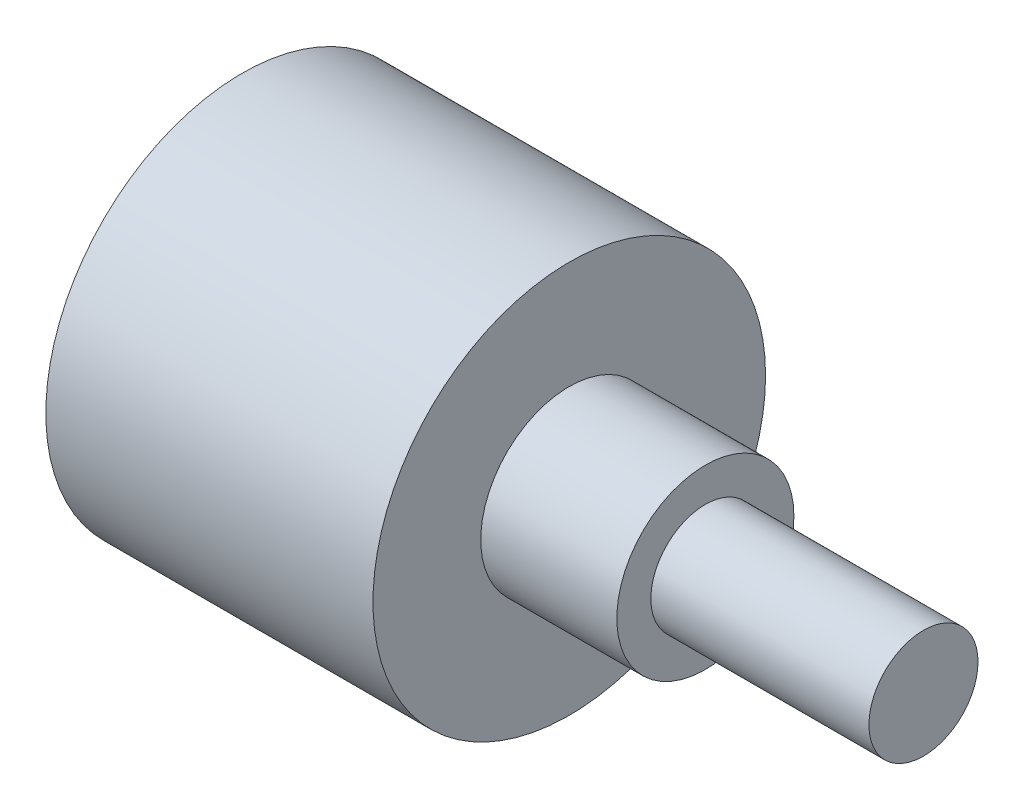
ISO-10303-21;
HEADER;
FILE_DESCRIPTION(('STEP AP214'),'2;1');
FILE_NAME('part.step','',(''),(''),'','','');
FILE_SCHEMA(('AUTOMOTIVE_DESIGN { 1 0 10303 214 1 1 1 1 }'));
ENDSEC;
DATA;
#1=APPLICATION_CONTEXT('core data for automotive mechanical design processes');
#2=APPLICATION_PROTOCOL_DEFINITION('international standard','automotive_design',2000,#1);
#3=PRODUCT_CONTEXT('',#1,'mechanical');
#4=PRODUCT('Part','Part','',(#3));
#5=PRODUCT_RELATED_PRODUCT_CATEGORY('part','',(#4));
#6=PRODUCT_DEFINITION_FORMATION('','',#4);
#7=PRODUCT_DEFINITION_CONTEXT('part definition',#1,'design');
#8=PRODUCT_DEFINITION('design','',#6,#7);
#9=PRODUCT_DEFINITION_SHAPE('','',#8);
#10=(LENGTH_UNIT() NAMED_UNIT(*) SI_UNIT(.MILLI.,.METRE.));
#11=(NAMED_UNIT(*) PLANE_ANGLE_UNIT() SI_UNIT($,.RADIAN.));
#12=(NAMED_UNIT(*) SI_UNIT($,.STERADIAN.) SOLID_ANGLE_UNIT());
#13=UNCERTAINTY_MEASURE_WITH_UNIT(LENGTH_MEASURE(1.E-05),#10,'distance_accuracy_value','');
#14=(GEOMETRIC_REPRESENTATION_CONTEXT(3) GLOBAL_UNCERTAINTY_ASSIGNED_CONTEXT((#13)) GLOBAL_UNIT_ASSIGNED_CONTEXT((#10,
#11,#12)) REPRESENTATION_CONTEXT('',''));
#15=CARTESIAN_POINT('',(0.,0.,0.));
#16=DIRECTION('',(0.,0.,1.));
#17=DIRECTION('',(1.,0.,0.));
#18=AXIS2_PLACEMENT_3D('',#15,#16,#17);
#19=CARTESIAN_POINT('',(0.,0.,0.));
#20=DIRECTION('',(-1.,0.,0.));
#21=DIRECTION('',(0.,0.,1.));
#22=AXIS2_PLACEMENT_3D('',#19,#20,#21);
#23=PLANE('',#22);
#24=CARTESIAN_POINT('',(0.,0.,0.));
#25=DIRECTION('',(1.,0.,0.));
#26=DIRECTION('',(0.,0.,-1.));
#27=AXIS2_PLACEMENT_3D('',#24,#25,#26);
#28=CIRCLE('',#27,11.43);
#29=CARTESIAN_POINT('',(0.,0.,-11.43));
#30=VERTEX_POINT('',#29);
#31=EDGE_CURVE('E10',#30,#30,#28,.T.);
#32=ORIENTED_EDGE('',*,*,#31,.F.);
#33=EDGE_LOOP('',(#32));
#34=FACE_BOUND('',#33,.T.);
#35=ADVANCED_FACE('F35',(#34),#23,.T.);
#36=CARTESIAN_POINT('',(0.,0.,0.));
#37=DIRECTION('',(1.,0.,0.));
#38=DIRECTION('',(0.,0.,-1.));
#39=AXIS2_PLACEMENT_3D('',#36,#37,#38);
#40=CYLINDRICAL_SURFACE('',#39,11.43);
#41=ORIENTED_EDGE('',*,*,#31,.T.);
#42=EDGE_LOOP('',(#41));
#43=FACE_BOUND('',#42,.T.);
#44=CARTESIAN_POINT('',(19.05,0.,0.));
#45=DIRECTION('',(1.,0.,0.));
#46=DIRECTION('',(0.,0.,-1.));
#47=AXIS2_PLACEMENT_3D('',#44,#45,#46);
#48=CIRCLE('',#47,11.43);
#49=CARTESIAN_POINT('',(19.05,0.,-11.43));
#50=VERTEX_POINT('',#49);
#51=EDGE_CURVE('E41',#50,#50,#48,.T.);
#52=ORIENTED_EDGE('',*,*,#51,.F.);
#53=EDGE_LOOP('',(#52));
#54=FACE_BOUND('',#53,.T.);
#55=ADVANCED_FACE('F77',(#43,#54),#40,.T.);
#56=CARTESIAN_POINT('',(19.05,0.,-11.43));
#57=DIRECTION('',(1.,0.,0.));
#58=DIRECTION('',(0.,0.,-1.));
#59=AXIS2_PLACEMENT_3D('',#56,#57,#58);
#60=PLANE('',#59);
#61=ORIENTED_EDGE('',*,*,#51,.T.);
#62=EDGE_LOOP('',(#61));
#63=FACE_BOUND('',#62,.T.);
#64=CARTESIAN_POINT('',(19.05,0.,0.));
#65=DIRECTION('',(1.,0.,0.));
#66=DIRECTION('',(0.,0.,-1.));
#67=AXIS2_PLACEMENT_3D('',#64,#65,#66);
#68=CIRCLE('',#67,5.1562);
#69=CARTESIAN_POINT('',(19.05,0.,-5.1562));
#70=VERTEX_POINT('',#69);
#71=EDGE_CURVE('E45',#70,#70,#68,.T.);
#72=ORIENTED_EDGE('',*,*,#71,.F.);
#73=EDGE_LOOP('',(#72));
#74=FACE_BOUND('',#73,.T.);
#75=ADVANCED_FACE('F82',(#63,#74),#60,.T.);
#76=CARTESIAN_POINT('',(0.,0.,0.));
#77=DIRECTION('',(1.,0.,0.));
#78=DIRECTION('',(0.,0.,-1.));
#79=AXIS2_PLACEMENT_3D('',#76,#77,#78);
#80=CYLINDRICAL_SURFACE('',#79,5.1562);
#81=ORIENTED_EDGE('',*,*,#71,.T.);
#82=EDGE_LOOP('',(#81));
#83=FACE_BOUND('',#82,.T.);
#84=CARTESIAN_POINT('',(26.9748,0.,0.));
#85=DIRECTION('',(1.,0.,0.));
#86=DIRECTION('',(0.,0.,-1.));
#87=AXIS2_PLACEMENT_3D('',#84,#85,#86);
#88=CIRCLE('',#87,5.1562);
#89=CARTESIAN_POINT('',(26.9748,0.,-5.1562));
#90=VERTEX_POINT('',#89);
#91=EDGE_CURVE('E49',#90,#90,#88,.T.);
#92=ORIENTED_EDGE('',*,*,#91,.F.);
#93=EDGE_LOOP('',(#92));
#94=FACE_BOUND('',#93,.T.);
#95=ADVANCED_FACE('F73',(#83,#94),#80,.T.);
#96=CARTESIAN_POINT('',(26.9748,0.,-5.1562));
#97=DIRECTION('',(1.,0.,0.));
#98=DIRECTION('',(0.,0.,-1.));
#99=AXIS2_PLACEMENT_3D('',#96,#97,#98);
#100=PLANE('',#99);
#101=ORIENTED_EDGE('',*,*,#91,.T.);
#102=EDGE_LOOP('',(#101));
#103=FACE_BOUND('',#102,.T.);
#104=CARTESIAN_POINT('',(26.9748,0.,0.));
#105=DIRECTION('',(1.,0.,0.));
#106=DIRECTION('',(0.,0.,-1.));
#107=AXIS2_PLACEMENT_3D('',#104,#105,#106);
#108=CIRCLE('',#107,3.175);
#109=CARTESIAN_POINT('',(26.9748,0.,-3.175));
#110=VERTEX_POINT('',#109);
#111=EDGE_CURVE('E54',#110,#110,#108,.T.);
#112=ORIENTED_EDGE('',*,*,#111,.F.);
#113=EDGE_LOOP('',(#112));
#114=FACE_BOUND('',#113,.T.);
#115=ADVANCED_FACE('F65',(#103,#114),#100,.T.);
#116=CARTESIAN_POINT('',(0.,0.,0.));
#117=DIRECTION('',(1.,0.,0.));
#118=DIRECTION('',(0.,0.,-1.));
#119=AXIS2_PLACEMENT_3D('',#116,#117,#118);
#120=CYLINDRICAL_SURFACE('',#119,3.175);
#121=ORIENTED_EDGE('',*,*,#111,.T.);
#122=EDGE_LOOP('',(#121));
#123=FACE_BOUND('',#122,.T.);
#124=CARTESIAN_POINT('',(39.6748,0.,0.));
#125=DIRECTION('',(1.,0.,0.));
#126=DIRECTION('',(0.,0.,-1.));
#127=AXIS2_PLACEMENT_3D('',#124,#125,#126);
#128=CIRCLE('',#127,3.175);
#129=CARTESIAN_POINT('',(39.6748,0.,-3.175));
#130=VERTEX_POINT('',#129);
#131=EDGE_CURVE('E57',#130,#130,#128,.T.);
#132=ORIENTED_EDGE('',*,*,#131,.F.);
#133=EDGE_LOOP('',(#132));
#134=FACE_BOUND('',#133,.T.);
#135=ADVANCED_FACE('F63',(#123,#134),#120,.T.);
#136=CARTESIAN_POINT('',(39.6748,0.,-3.175));
#137=DIRECTION('',(1.,0.,0.));
#138=DIRECTION('',(0.,0.,-1.));
#139=AXIS2_PLACEMENT_3D('',#136,#137,#138);
#140=PLANE('',#139);
#141=ORIENTED_EDGE('',*,*,#131,.T.);
#142=EDGE_LOOP('',(#141));
#143=FACE_BOUND('',#142,.T.);
#144=ADVANCED_FACE('F61',(#143),#140,.T.);
#145=CLOSED_SHELL('',(#35,#55,#75,#95,#115,#135,#144));
#146=MANIFOLD_SOLID_BREP('B2',#145);
#147=ADVANCED_BREP_SHAPE_REPRESENTATION('',(#18,#146),#14);
#148=SHAPE_DEFINITION_REPRESENTATION(#9,#147);
ENDSEC;
END-ISO-10303-21;
